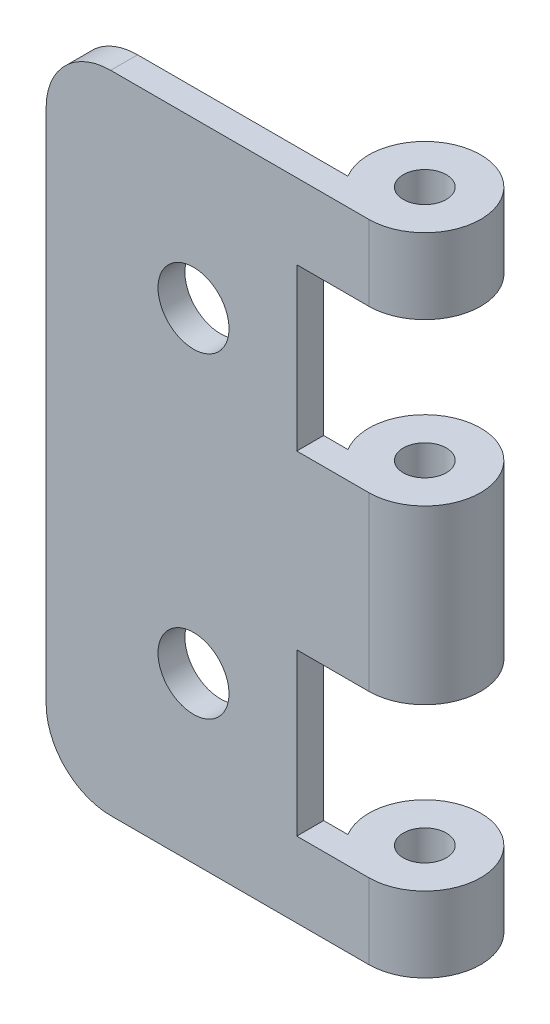
ISO-10303-21;
HEADER;
FILE_DESCRIPTION(('STEP AP214'),'2;1');
FILE_NAME('part.step','',(''),(''),'','','');
FILE_SCHEMA(('AUTOMOTIVE_DESIGN { 1 0 10303 214 1 1 1 1 }'));
ENDSEC;
DATA;
#1=APPLICATION_CONTEXT('core data for automotive mechanical design processes');
#2=APPLICATION_PROTOCOL_DEFINITION('international standard','automotive_design',2000,#1);
#3=PRODUCT_CONTEXT('',#1,'mechanical');
#4=PRODUCT('Part','Part','',(#3));
#5=PRODUCT_RELATED_PRODUCT_CATEGORY('part','',(#4));
#6=PRODUCT_DEFINITION_FORMATION('','',#4);
#7=PRODUCT_DEFINITION_CONTEXT('part definition',#1,'design');
#8=PRODUCT_DEFINITION('design','',#6,#7);
#9=PRODUCT_DEFINITION_SHAPE('','',#8);
#10=(LENGTH_UNIT() NAMED_UNIT(*) SI_UNIT(.MILLI.,.METRE.));
#11=(NAMED_UNIT(*) PLANE_ANGLE_UNIT() SI_UNIT($,.RADIAN.));
#12=(NAMED_UNIT(*) SI_UNIT($,.STERADIAN.) SOLID_ANGLE_UNIT());
#13=UNCERTAINTY_MEASURE_WITH_UNIT(LENGTH_MEASURE(1.E-05),#10,'distance_accuracy_value','');
#14=(GEOMETRIC_REPRESENTATION_CONTEXT(3) GLOBAL_UNCERTAINTY_ASSIGNED_CONTEXT((#13)) GLOBAL_UNIT_ASSIGNED_CONTEXT((#10,
#11,#12)) REPRESENTATION_CONTEXT('',''));
#15=CARTESIAN_POINT('',(0.,0.,0.));
#16=DIRECTION('',(0.,0.,1.));
#17=DIRECTION('',(1.,0.,0.));
#18=AXIS2_PLACEMENT_3D('',#15,#16,#17);
#19=CARTESIAN_POINT('',(7.62,68.58,-2.6658271083128));
#20=DIRECTION('',(0.,0.,1.));
#21=DIRECTION('',(1.,0.,0.));
#22=AXIS2_PLACEMENT_3D('',#19,#20,#21);
#23=CYLINDRICAL_SURFACE('',#22,7.62);
#24=DIRECTION('',(0.,0.,1.));
#25=VECTOR('',#24,1.);
#26=CARTESIAN_POINT('',(7.62,76.2,-2.6658271083128));
#27=LINE('',#26,#25);
#28=CARTESIAN_POINT('',(7.62,76.2,-3.175));
#29=VERTEX_POINT('',#28);
#30=CARTESIAN_POINT('',(7.62,76.2,0.));
#31=VERTEX_POINT('',#30);
#32=EDGE_CURVE('E189',#29,#31,#27,.T.);
#33=ORIENTED_EDGE('',*,*,#32,.F.);
#34=CARTESIAN_POINT('',(7.62,68.58,-3.175));
#35=DIRECTION('',(0.,0.,-1.));
#36=DIRECTION('',(-1.,0.,0.));
#37=AXIS2_PLACEMENT_3D('',#34,#35,#36);
#38=CIRCLE('',#37,7.62);
#39=CARTESIAN_POINT('',(0.,68.58,-3.175));
#40=VERTEX_POINT('',#39);
#41=EDGE_CURVE('E42',#40,#29,#38,.T.);
#42=ORIENTED_EDGE('',*,*,#41,.F.);
#43=DIRECTION('',(0.,0.,1.));
#44=VECTOR('',#43,1.);
#45=CARTESIAN_POINT('',(0.,68.58,-2.6658271083128));
#46=LINE('',#45,#44);
#47=CARTESIAN_POINT('',(0.,68.58,0.));
#48=VERTEX_POINT('',#47);
#49=EDGE_CURVE('E192',#48,#40,#46,.F.);
#50=ORIENTED_EDGE('',*,*,#49,.F.);
#51=CARTESIAN_POINT('',(7.62,68.58,0.));
#52=DIRECTION('',(0.,0.,-1.));
#53=DIRECTION('',(-1.,0.,0.));
#54=AXIS2_PLACEMENT_3D('',#51,#52,#53);
#55=CIRCLE('',#54,7.62);
#56=EDGE_CURVE('E11',#31,#48,#55,.F.);
#57=ORIENTED_EDGE('',*,*,#56,.F.);
#58=EDGE_LOOP('',(#33,#42,#50,#57));
#59=FACE_BOUND('',#58,.T.);
#60=ADVANCED_FACE('F35',(#59),#23,.T.);
#61=CARTESIAN_POINT('',(7.62,7.62,-2.6658271083128));
#62=DIRECTION('',(0.,0.,-1.));
#63=DIRECTION('',(-1.,0.,0.));
#64=AXIS2_PLACEMENT_3D('',#61,#62,#63);
#65=CYLINDRICAL_SURFACE('',#64,7.62);
#66=DIRECTION('',(0.,0.,1.));
#67=VECTOR('',#66,1.);
#68=CARTESIAN_POINT('',(0.,7.62,-2.6658271083128));
#69=LINE('',#68,#67);
#70=CARTESIAN_POINT('',(0.,7.62000000000002,-3.175));
#71=VERTEX_POINT('',#70);
#72=CARTESIAN_POINT('',(0.,7.62000000000002,0.));
#73=VERTEX_POINT('',#72);
#74=EDGE_CURVE('E172',#71,#73,#69,.T.);
#75=ORIENTED_EDGE('',*,*,#74,.F.);
#76=CARTESIAN_POINT('',(7.62,7.62,-3.175));
#77=DIRECTION('',(0.,0.,-1.));
#78=DIRECTION('',(-1.,0.,0.));
#79=AXIS2_PLACEMENT_3D('',#76,#77,#78);
#80=CIRCLE('',#79,7.62);
#81=CARTESIAN_POINT('',(7.62,0.,-3.175));
#82=VERTEX_POINT('',#81);
#83=EDGE_CURVE('E184',#82,#71,#80,.T.);
#84=ORIENTED_EDGE('',*,*,#83,.F.);
#85=DIRECTION('',(0.,0.,1.));
#86=VECTOR('',#85,1.);
#87=CARTESIAN_POINT('',(7.62,0.,-2.6658271083128));
#88=LINE('',#87,#86);
#89=CARTESIAN_POINT('',(7.62,0.,0.));
#90=VERTEX_POINT('',#89);
#91=EDGE_CURVE('E181',#90,#82,#88,.F.);
#92=ORIENTED_EDGE('',*,*,#91,.F.);
#93=CARTESIAN_POINT('',(7.62,7.62,0.));
#94=DIRECTION('',(0.,0.,-1.));
#95=DIRECTION('',(-1.,0.,0.));
#96=AXIS2_PLACEMENT_3D('',#93,#94,#95);
#97=CIRCLE('',#96,7.62);
#98=EDGE_CURVE('E187',#73,#90,#97,.F.);
#99=ORIENTED_EDGE('',*,*,#98,.F.);
#100=EDGE_LOOP('',(#75,#84,#92,#99));
#101=FACE_BOUND('',#100,.T.);
#102=ADVANCED_FACE('F300',(#101),#65,.T.);
#103=CARTESIAN_POINT('',(-13.8136565855366,76.2,0.));
#104=DIRECTION('',(0.,0.,-1.));
#105=DIRECTION('',(-1.,0.,0.));
#106=AXIS2_PLACEMENT_3D('',#103,#104,#105);
#107=PLANE('',#106);
#108=CARTESIAN_POINT('',(17.399,56.769,0.));
#109=DIRECTION('',(0.,0.,-1.));
#110=DIRECTION('',(-1.,0.,0.));
#111=AXIS2_PLACEMENT_3D('',#108,#109,#110);
#112=CIRCLE('',#111,4.191);
#113=CARTESIAN_POINT('',(13.208,56.769,0.));
#114=VERTEX_POINT('',#113);
#115=EDGE_CURVE('E210',#114,#114,#112,.T.);
#116=ORIENTED_EDGE('',*,*,#115,.T.);
#117=EDGE_LOOP('',(#116));
#118=FACE_BOUND('',#117,.T.);
#119=CARTESIAN_POINT('',(17.399,19.431,0.));
#120=DIRECTION('',(0.,0.,-1.));
#121=DIRECTION('',(-1.,0.,0.));
#122=AXIS2_PLACEMENT_3D('',#119,#120,#121);
#123=CIRCLE('',#122,4.191);
#124=CARTESIAN_POINT('',(13.208,19.431,0.));
#125=VERTEX_POINT('',#124);
#126=EDGE_CURVE('E223',#125,#125,#123,.T.);
#127=ORIENTED_EDGE('',*,*,#126,.T.);
#128=EDGE_LOOP('',(#127));
#129=FACE_BOUND('',#128,.T.);
#130=DIRECTION('',(1.,0.,0.));
#131=VECTOR('',#130,1.);
#132=CARTESIAN_POINT('',(-13.8136565855366,76.2,0.));
#133=LINE('',#132,#131);
#134=CARTESIAN_POINT('',(38.1,76.2,0.));
#135=VERTEX_POINT('',#134);
#136=EDGE_CURVE('E203',#31,#135,#133,.T.);
#137=ORIENTED_EDGE('',*,*,#136,.F.);
#138=ORIENTED_EDGE('',*,*,#56,.T.);
#139=DIRECTION('',(0.,-1.,0.));
#140=VECTOR('',#139,1.);
#141=CARTESIAN_POINT('',(0.,76.2,0.));
#142=LINE('',#141,#140);
#143=EDGE_CURVE('E201',#48,#73,#142,.T.);
#144=ORIENTED_EDGE('',*,*,#143,.T.);
#145=ORIENTED_EDGE('',*,*,#98,.T.);
#146=DIRECTION('',(1.,0.,0.));
#147=VECTOR('',#146,1.);
#148=CARTESIAN_POINT('',(-13.8136565855366,0.,0.));
#149=LINE('',#148,#147);
#150=CARTESIAN_POINT('',(38.1,0.,0.));
#151=VERTEX_POINT('',#150);
#152=EDGE_CURVE('E207',#90,#151,#149,.T.);
#153=ORIENTED_EDGE('',*,*,#152,.T.);
#154=DIRECTION('',(0.,-1.,0.));
#155=VECTOR('',#154,1.);
#156=CARTESIAN_POINT('',(38.1,76.2,0.));
#157=LINE('',#156,#155);
#158=CARTESIAN_POINT('',(38.1,8.89,0.));
#159=VERTEX_POINT('',#158);
#160=EDGE_CURVE('E163',#159,#151,#157,.T.);
#161=ORIENTED_EDGE('',*,*,#160,.F.);
#162=DIRECTION('',(1.,0.,0.));
#163=VECTOR('',#162,1.);
#164=CARTESIAN_POINT('',(-13.8136565855366,8.89,0.));
#165=LINE('',#164,#163);
#166=CARTESIAN_POINT('',(29.591,8.89,0.));
#167=VERTEX_POINT('',#166);
#168=EDGE_CURVE('E244',#167,#159,#165,.T.);
#169=ORIENTED_EDGE('',*,*,#168,.F.);
#170=DIRECTION('',(0.,-1.,0.));
#171=VECTOR('',#170,1.);
#172=CARTESIAN_POINT('',(29.591,27.94,0.));
#173=LINE('',#172,#171);
#174=CARTESIAN_POINT('',(29.591,27.94,0.));
#175=VERTEX_POINT('',#174);
#176=EDGE_CURVE('E232',#175,#167,#173,.T.);
#177=ORIENTED_EDGE('',*,*,#176,.F.);
#178=DIRECTION('',(1.,0.,0.));
#179=VECTOR('',#178,1.);
#180=CARTESIAN_POINT('',(-13.8136565855366,27.94,0.));
#181=LINE('',#180,#179);
#182=CARTESIAN_POINT('',(38.1,27.94,0.));
#183=VERTEX_POINT('',#182);
#184=EDGE_CURVE('E238',#175,#183,#181,.T.);
#185=ORIENTED_EDGE('',*,*,#184,.T.);
#186=CARTESIAN_POINT('',(38.1,48.26,0.));
#187=VERTEX_POINT('',#186);
#188=EDGE_CURVE('E173',#187,#183,#157,.T.);
#189=ORIENTED_EDGE('',*,*,#188,.F.);
#190=DIRECTION('',(1.,0.,0.));
#191=VECTOR('',#190,1.);
#192=CARTESIAN_POINT('',(-13.8136565855366,48.26,0.));
#193=LINE('',#192,#191);
#194=CARTESIAN_POINT('',(29.591,48.26,0.));
#195=VERTEX_POINT('',#194);
#196=EDGE_CURVE('E139',#195,#187,#193,.T.);
#197=ORIENTED_EDGE('',*,*,#196,.F.);
#198=DIRECTION('',(0.,1.,0.));
#199=VECTOR('',#198,1.);
#200=CARTESIAN_POINT('',(29.591,48.26,0.));
#201=LINE('',#200,#199);
#202=CARTESIAN_POINT('',(29.591,67.31,0.));
#203=VERTEX_POINT('',#202);
#204=EDGE_CURVE('E246',#195,#203,#201,.T.);
#205=ORIENTED_EDGE('',*,*,#204,.T.);
#206=DIRECTION('',(1.,0.,0.));
#207=VECTOR('',#206,1.);
#208=CARTESIAN_POINT('',(-13.8136565855366,67.31,0.));
#209=LINE('',#208,#207);
#210=CARTESIAN_POINT('',(38.1,67.31,0.));
#211=VERTEX_POINT('',#210);
#212=EDGE_CURVE('E143',#203,#211,#209,.T.);
#213=ORIENTED_EDGE('',*,*,#212,.T.);
#214=EDGE_CURVE('E169',#135,#211,#157,.T.);
#215=ORIENTED_EDGE('',*,*,#214,.F.);
#216=EDGE_LOOP('',(#137,#138,#144,#145,#153,#161,#169,#177,#185,#189,#197,#205,#213,#215));
#217=FACE_BOUND('',#216,.T.);
#218=ADVANCED_FACE('F304',(#118,#129,#217),#107,.F.);
#219=CARTESIAN_POINT('',(38.1,76.2,-6.604));
#220=DIRECTION('',(0.,-1.,0.));
#221=DIRECTION('',(0.,0.,-1.));
#222=AXIS2_PLACEMENT_3D('',#219,#220,#221);
#223=CYLINDRICAL_SURFACE('',#222,6.604);
#224=CARTESIAN_POINT('',(38.1,48.26,-6.604));
#225=DIRECTION('',(0.,1.,0.));
#226=DIRECTION('',(0.,0.,1.));
#227=AXIS2_PLACEMENT_3D('',#224,#225,#226);
#228=CIRCLE('',#227,6.604);
#229=CARTESIAN_POINT('',(32.4559965450046,48.26,-3.175));
#230=VERTEX_POINT('',#229);
#231=EDGE_CURVE('E132',#187,#230,#228,.T.);
#232=ORIENTED_EDGE('',*,*,#231,.F.);
#233=ORIENTED_EDGE('',*,*,#188,.T.);
#234=CARTESIAN_POINT('',(38.1,27.94,-6.604));
#235=DIRECTION('',(0.,1.,0.));
#236=DIRECTION('',(0.,0.,1.));
#237=AXIS2_PLACEMENT_3D('',#234,#235,#236);
#238=CIRCLE('',#237,6.604);
#239=CARTESIAN_POINT('',(32.4559965450046,27.94,-3.175));
#240=VERTEX_POINT('',#239);
#241=EDGE_CURVE('E158',#183,#240,#238,.T.);
#242=ORIENTED_EDGE('',*,*,#241,.T.);
#243=DIRECTION('',(0.,-1.,0.));
#244=VECTOR('',#243,1.);
#245=CARTESIAN_POINT('',(32.4559965450046,76.2,-3.175));
#246=LINE('',#245,#244);
#247=EDGE_CURVE('E149',#230,#240,#246,.T.);
#248=ORIENTED_EDGE('',*,*,#247,.F.);
#249=EDGE_LOOP('',(#232,#233,#242,#248));
#250=FACE_BOUND('',#249,.T.);
#251=ADVANCED_FACE('F156',(#250),#223,.T.);
#252=CARTESIAN_POINT('',(-13.8136565855366,76.2,-3.175));
#253=DIRECTION('',(0.,0.,-1.));
#254=DIRECTION('',(-1.,0.,0.));
#255=AXIS2_PLACEMENT_3D('',#252,#253,#254);
#256=PLANE('',#255);
#257=CARTESIAN_POINT('',(17.399,56.769,-3.175));
#258=DIRECTION('',(0.,0.,-1.));
#259=DIRECTION('',(-1.,0.,0.));
#260=AXIS2_PLACEMENT_3D('',#257,#258,#259);
#261=CIRCLE('',#260,4.191);
#262=CARTESIAN_POINT('',(13.208,56.769,-3.175));
#263=VERTEX_POINT('',#262);
#264=EDGE_CURVE('E220',#263,#263,#261,.T.);
#265=ORIENTED_EDGE('',*,*,#264,.F.);
#266=EDGE_LOOP('',(#265));
#267=FACE_BOUND('',#266,.T.);
#268=CARTESIAN_POINT('',(17.399,19.431,-3.175));
#269=DIRECTION('',(0.,0.,-1.));
#270=DIRECTION('',(-1.,0.,0.));
#271=AXIS2_PLACEMENT_3D('',#268,#269,#270);
#272=CIRCLE('',#271,4.191);
#273=CARTESIAN_POINT('',(13.208,19.431,-3.175));
#274=VERTEX_POINT('',#273);
#275=EDGE_CURVE('E226',#274,#274,#272,.T.);
#276=ORIENTED_EDGE('',*,*,#275,.F.);
#277=EDGE_LOOP('',(#276));
#278=FACE_BOUND('',#277,.T.);
#279=DIRECTION('',(0.,-1.,0.));
#280=VECTOR('',#279,1.);
#281=CARTESIAN_POINT('',(0.,76.2,-3.175));
#282=LINE('',#281,#280);
#283=EDGE_CURVE('E165',#40,#71,#282,.T.);
#284=ORIENTED_EDGE('',*,*,#283,.F.);
#285=ORIENTED_EDGE('',*,*,#41,.T.);
#286=DIRECTION('',(1.,0.,0.));
#287=VECTOR('',#286,1.);
#288=CARTESIAN_POINT('',(-13.8136565855366,76.2,-3.175));
#289=LINE('',#288,#287);
#290=CARTESIAN_POINT('',(32.4559965450046,76.2,-3.175));
#291=VERTEX_POINT('',#290);
#292=EDGE_CURVE('E194',#29,#291,#289,.T.);
#293=ORIENTED_EDGE('',*,*,#292,.T.);
#294=CARTESIAN_POINT('',(32.4559965450046,67.31,-3.175));
#295=VERTEX_POINT('',#294);
#296=EDGE_CURVE('E159',#291,#295,#246,.T.);
#297=ORIENTED_EDGE('',*,*,#296,.T.);
#298=DIRECTION('',(1.,0.,0.));
#299=VECTOR('',#298,1.);
#300=CARTESIAN_POINT('',(-13.8136565855366,67.31,-3.175));
#301=LINE('',#300,#299);
#302=CARTESIAN_POINT('',(29.591,67.31,-3.175));
#303=VERTEX_POINT('',#302);
#304=EDGE_CURVE('E262',#303,#295,#301,.T.);
#305=ORIENTED_EDGE('',*,*,#304,.F.);
#306=DIRECTION('',(0.,1.,0.));
#307=VECTOR('',#306,1.);
#308=CARTESIAN_POINT('',(29.591,48.26,-3.175));
#309=LINE('',#308,#307);
#310=CARTESIAN_POINT('',(29.591,48.26,-3.175));
#311=VERTEX_POINT('',#310);
#312=EDGE_CURVE('E152',#311,#303,#309,.T.);
#313=ORIENTED_EDGE('',*,*,#312,.F.);
#314=DIRECTION('',(1.,0.,0.));
#315=VECTOR('',#314,1.);
#316=CARTESIAN_POINT('',(-13.8136565855366,48.26,-3.175));
#317=LINE('',#316,#315);
#318=EDGE_CURVE('E136',#311,#230,#317,.T.);
#319=ORIENTED_EDGE('',*,*,#318,.T.);
#320=ORIENTED_EDGE('',*,*,#247,.T.);
#321=DIRECTION('',(1.,0.,0.));
#322=VECTOR('',#321,1.);
#323=CARTESIAN_POINT('',(-13.8136565855366,27.94,-3.175));
#324=LINE('',#323,#322);
#325=CARTESIAN_POINT('',(29.591,27.94,-3.175));
#326=VERTEX_POINT('',#325);
#327=EDGE_CURVE('E249',#326,#240,#324,.T.);
#328=ORIENTED_EDGE('',*,*,#327,.F.);
#329=DIRECTION('',(0.,-1.,0.));
#330=VECTOR('',#329,1.);
#331=CARTESIAN_POINT('',(29.591,27.94,-3.175));
#332=LINE('',#331,#330);
#333=CARTESIAN_POINT('',(29.591,8.89,-3.175));
#334=VERTEX_POINT('',#333);
#335=EDGE_CURVE('E229',#326,#334,#332,.T.);
#336=ORIENTED_EDGE('',*,*,#335,.T.);
#337=DIRECTION('',(1.,0.,0.));
#338=VECTOR('',#337,1.);
#339=CARTESIAN_POINT('',(-13.8136565855366,8.89,-3.175));
#340=LINE('',#339,#338);
#341=CARTESIAN_POINT('',(32.4559965450046,8.89000000000002,-3.175));
#342=VERTEX_POINT('',#341);
#343=EDGE_CURVE('E239',#334,#342,#340,.T.);
#344=ORIENTED_EDGE('',*,*,#343,.T.);
#345=CARTESIAN_POINT('',(32.4559965450046,0.,-3.175));
#346=VERTEX_POINT('',#345);
#347=EDGE_CURVE('E160',#342,#346,#246,.T.);
#348=ORIENTED_EDGE('',*,*,#347,.T.);
#349=DIRECTION('',(1.,0.,0.));
#350=VECTOR('',#349,1.);
#351=CARTESIAN_POINT('',(-13.8136565855366,0.,-3.175));
#352=LINE('',#351,#350);
#353=EDGE_CURVE('E213',#82,#346,#352,.T.);
#354=ORIENTED_EDGE('',*,*,#353,.F.);
#355=ORIENTED_EDGE('',*,*,#83,.T.);
#356=EDGE_LOOP('',(#284,#285,#293,#297,#305,#313,#319,#320,#328,#336,#344,#348,#354,#355));
#357=FACE_BOUND('',#356,.T.);
#358=ADVANCED_FACE('F147',(#267,#278,#357),#256,.T.);
#359=CARTESIAN_POINT('',(38.1,8.89,-6.604));
#360=DIRECTION('',(0.,1.,0.));
#361=DIRECTION('',(0.,0.,1.));
#362=AXIS2_PLACEMENT_3D('',#359,#360,#361);
#363=CIRCLE('',#362,6.604);
#364=EDGE_CURVE('E242',#159,#342,#363,.T.);
#365=ORIENTED_EDGE('',*,*,#364,.F.);
#366=ORIENTED_EDGE('',*,*,#160,.T.);
#367=CARTESIAN_POINT('',(38.1,0.,-6.604));
#368=DIRECTION('',(0.,1.,0.));
#369=DIRECTION('',(0.,0.,1.));
#370=AXIS2_PLACEMENT_3D('',#367,#368,#369);
#371=CIRCLE('',#370,6.604);
#372=EDGE_CURVE('E209',#151,#346,#371,.T.);
#373=ORIENTED_EDGE('',*,*,#372,.T.);
#374=ORIENTED_EDGE('',*,*,#347,.F.);
#375=EDGE_LOOP('',(#365,#366,#373,#374));
#376=FACE_BOUND('',#375,.T.);
#377=ADVANCED_FACE('F317',(#376),#223,.T.);
#378=ORIENTED_EDGE('',*,*,#214,.T.);
#379=CARTESIAN_POINT('',(38.1,67.31,-6.604));
#380=DIRECTION('',(0.,1.,0.));
#381=DIRECTION('',(0.,0.,1.));
#382=AXIS2_PLACEMENT_3D('',#379,#380,#381);
#383=CIRCLE('',#382,6.604);
#384=EDGE_CURVE('E264',#211,#295,#383,.T.);
#385=ORIENTED_EDGE('',*,*,#384,.T.);
#386=ORIENTED_EDGE('',*,*,#296,.F.);
#387=CARTESIAN_POINT('',(38.1,76.2,-6.604));
#388=DIRECTION('',(0.,1.,0.));
#389=DIRECTION('',(0.,0.,1.));
#390=AXIS2_PLACEMENT_3D('',#387,#388,#389);
#391=CIRCLE('',#390,6.604);
#392=EDGE_CURVE('E199',#135,#291,#391,.T.);
#393=ORIENTED_EDGE('',*,*,#392,.F.);
#394=EDGE_LOOP('',(#378,#385,#386,#393));
#395=FACE_BOUND('',#394,.T.);
#396=ADVANCED_FACE('F313',(#395),#223,.T.);
#397=CARTESIAN_POINT('',(0.,76.2,-2.6658271083128));
#398=DIRECTION('',(-1.,0.,0.));
#399=DIRECTION('',(0.,0.,1.));
#400=AXIS2_PLACEMENT_3D('',#397,#398,#399);
#401=PLANE('',#400);
#402=ORIENTED_EDGE('',*,*,#143,.F.);
#403=ORIENTED_EDGE('',*,*,#49,.T.);
#404=ORIENTED_EDGE('',*,*,#283,.T.);
#405=ORIENTED_EDGE('',*,*,#74,.T.);
#406=EDGE_LOOP('',(#402,#403,#404,#405));
#407=FACE_BOUND('',#406,.T.);
#408=ADVANCED_FACE('F316',(#407),#401,.T.);
#409=CARTESIAN_POINT('',(-13.8136565855366,76.2,-2.6658271083128));
#410=DIRECTION('',(0.,1.,0.));
#411=DIRECTION('',(0.,0.,1.));
#412=AXIS2_PLACEMENT_3D('',#409,#410,#411);
#413=PLANE('',#412);
#414=CARTESIAN_POINT('',(38.1,76.2,-6.604));
#415=DIRECTION('',(0.,1.,0.));
#416=DIRECTION('',(0.,0.,1.));
#417=AXIS2_PLACEMENT_3D('',#414,#415,#416);
#418=CIRCLE('',#417,2.54);
#419=CARTESIAN_POINT('',(38.1,76.2,-4.064));
#420=VERTEX_POINT('',#419);
#421=EDGE_CURVE('E277',#420,#420,#418,.T.);
#422=ORIENTED_EDGE('',*,*,#421,.F.);
#423=EDGE_LOOP('',(#422));
#424=FACE_BOUND('',#423,.T.);
#425=ORIENTED_EDGE('',*,*,#292,.F.);
#426=ORIENTED_EDGE('',*,*,#32,.T.);
#427=ORIENTED_EDGE('',*,*,#136,.T.);
#428=ORIENTED_EDGE('',*,*,#392,.T.);
#429=EDGE_LOOP('',(#425,#426,#427,#428));
#430=FACE_BOUND('',#429,.T.);
#431=ADVANCED_FACE('F197',(#424,#430),#413,.T.);
#432=CARTESIAN_POINT('',(-13.8136565855366,0.,-2.6658271083128));
#433=DIRECTION('',(0.,1.,0.));
#434=DIRECTION('',(0.,0.,1.));
#435=AXIS2_PLACEMENT_3D('',#432,#433,#434);
#436=PLANE('',#435);
#437=CARTESIAN_POINT('',(38.1,0.,-6.604));
#438=DIRECTION('',(0.,1.,0.));
#439=DIRECTION('',(0.,0.,1.));
#440=AXIS2_PLACEMENT_3D('',#437,#438,#439);
#441=CIRCLE('',#440,2.54);
#442=CARTESIAN_POINT('',(38.1,0.,-4.064));
#443=VERTEX_POINT('',#442);
#444=EDGE_CURVE('E178',#443,#443,#441,.T.);
#445=ORIENTED_EDGE('',*,*,#444,.T.);
#446=EDGE_LOOP('',(#445));
#447=FACE_BOUND('',#446,.T.);
#448=ORIENTED_EDGE('',*,*,#152,.F.);
#449=ORIENTED_EDGE('',*,*,#91,.T.);
#450=ORIENTED_EDGE('',*,*,#353,.T.);
#451=ORIENTED_EDGE('',*,*,#372,.F.);
#452=EDGE_LOOP('',(#448,#449,#450,#451));
#453=FACE_BOUND('',#452,.T.);
#454=ADVANCED_FACE('F283',(#447,#453),#436,.F.);
#455=CARTESIAN_POINT('',(17.399,56.769,47.625));
#456=DIRECTION('',(0.,0.,-1.));
#457=DIRECTION('',(-1.,0.,0.));
#458=AXIS2_PLACEMENT_3D('',#455,#456,#457);
#459=CYLINDRICAL_SURFACE('',#458,4.191);
#460=ORIENTED_EDGE('',*,*,#264,.T.);
#461=EDGE_LOOP('',(#460));
#462=FACE_BOUND('',#461,.T.);
#463=ORIENTED_EDGE('',*,*,#115,.F.);
#464=EDGE_LOOP('',(#463));
#465=FACE_BOUND('',#464,.T.);
#466=ADVANCED_FACE('F327',(#462,#465),#459,.F.);
#467=CARTESIAN_POINT('',(17.399,19.431,47.625));
#468=DIRECTION('',(0.,0.,-1.));
#469=DIRECTION('',(-1.,0.,0.));
#470=AXIS2_PLACEMENT_3D('',#467,#468,#469);
#471=CYLINDRICAL_SURFACE('',#470,4.191);
#472=ORIENTED_EDGE('',*,*,#275,.T.);
#473=EDGE_LOOP('',(#472));
#474=FACE_BOUND('',#473,.T.);
#475=ORIENTED_EDGE('',*,*,#126,.F.);
#476=EDGE_LOOP('',(#475));
#477=FACE_BOUND('',#476,.T.);
#478=ADVANCED_FACE('F333',(#474,#477),#471,.F.);
#479=CARTESIAN_POINT('',(29.591,27.94,-2.6658271083128));
#480=DIRECTION('',(-1.,0.,0.));
#481=DIRECTION('',(0.,0.,1.));
#482=AXIS2_PLACEMENT_3D('',#479,#480,#481);
#483=PLANE('',#482);
#484=DIRECTION('',(0.,0.,-1.));
#485=VECTOR('',#484,1.);
#486=CARTESIAN_POINT('',(29.591,8.89,-2.6658271083128));
#487=LINE('',#486,#485);
#488=EDGE_CURVE('E235',#167,#334,#487,.T.);
#489=ORIENTED_EDGE('',*,*,#488,.T.);
#490=ORIENTED_EDGE('',*,*,#335,.F.);
#491=DIRECTION('',(0.,0.,-1.));
#492=VECTOR('',#491,1.);
#493=CARTESIAN_POINT('',(29.591,27.94,-2.6658271083128));
#494=LINE('',#493,#492);
#495=EDGE_CURVE('E234',#175,#326,#494,.T.);
#496=ORIENTED_EDGE('',*,*,#495,.F.);
#497=ORIENTED_EDGE('',*,*,#176,.T.);
#498=EDGE_LOOP('',(#489,#490,#496,#497));
#499=FACE_BOUND('',#498,.T.);
#500=ADVANCED_FACE('F337',(#499),#483,.F.);
#501=CARTESIAN_POINT('',(-13.8136565855366,27.94,-2.6658271083128));
#502=DIRECTION('',(0.,1.,0.));
#503=DIRECTION('',(0.,0.,1.));
#504=AXIS2_PLACEMENT_3D('',#501,#502,#503);
#505=PLANE('',#504);
#506=CARTESIAN_POINT('',(38.1,27.94,-6.604));
#507=DIRECTION('',(0.,1.,0.));
#508=DIRECTION('',(0.,0.,1.));
#509=AXIS2_PLACEMENT_3D('',#506,#507,#508);
#510=CIRCLE('',#509,2.54);
#511=CARTESIAN_POINT('',(38.1,27.94,-4.064));
#512=VERTEX_POINT('',#511);
#513=EDGE_CURVE('E267',#512,#512,#510,.T.);
#514=ORIENTED_EDGE('',*,*,#513,.T.);
#515=EDGE_LOOP('',(#514));
#516=FACE_BOUND('',#515,.T.);
#517=ORIENTED_EDGE('',*,*,#184,.F.);
#518=ORIENTED_EDGE('',*,*,#495,.T.);
#519=ORIENTED_EDGE('',*,*,#327,.T.);
#520=ORIENTED_EDGE('',*,*,#241,.F.);
#521=EDGE_LOOP('',(#517,#518,#519,#520));
#522=FACE_BOUND('',#521,.T.);
#523=ADVANCED_FACE('F341',(#516,#522),#505,.F.);
#524=CARTESIAN_POINT('',(-13.8136565855366,8.89,-2.6658271083128));
#525=DIRECTION('',(0.,1.,0.));
#526=DIRECTION('',(0.,0.,1.));
#527=AXIS2_PLACEMENT_3D('',#524,#525,#526);
#528=PLANE('',#527);
#529=CARTESIAN_POINT('',(38.1,8.89,-6.604));
#530=DIRECTION('',(0.,1.,0.));
#531=DIRECTION('',(0.,0.,1.));
#532=AXIS2_PLACEMENT_3D('',#529,#530,#531);
#533=CIRCLE('',#532,2.54);
#534=CARTESIAN_POINT('',(38.1,8.89,-4.064));
#535=VERTEX_POINT('',#534);
#536=EDGE_CURVE('E272',#535,#535,#533,.T.);
#537=ORIENTED_EDGE('',*,*,#536,.F.);
#538=EDGE_LOOP('',(#537));
#539=FACE_BOUND('',#538,.T.);
#540=ORIENTED_EDGE('',*,*,#168,.T.);
#541=ORIENTED_EDGE('',*,*,#364,.T.);
#542=ORIENTED_EDGE('',*,*,#343,.F.);
#543=ORIENTED_EDGE('',*,*,#488,.F.);
#544=EDGE_LOOP('',(#540,#541,#542,#543));
#545=FACE_BOUND('',#544,.T.);
#546=ADVANCED_FACE('F343',(#539,#545),#528,.T.);
#547=CARTESIAN_POINT('',(29.591,48.26,-2.6658271083128));
#548=DIRECTION('',(1.,0.,0.));
#549=DIRECTION('',(0.,0.,-1.));
#550=AXIS2_PLACEMENT_3D('',#547,#548,#549);
#551=PLANE('',#550);
#552=DIRECTION('',(0.,0.,-1.));
#553=VECTOR('',#552,1.);
#554=CARTESIAN_POINT('',(29.591,67.31,-2.6658271083128));
#555=LINE('',#554,#553);
#556=EDGE_CURVE('E259',#203,#303,#555,.T.);
#557=ORIENTED_EDGE('',*,*,#556,.F.);
#558=ORIENTED_EDGE('',*,*,#204,.F.);
#559=DIRECTION('',(0.,0.,-1.));
#560=VECTOR('',#559,1.);
#561=CARTESIAN_POINT('',(29.591,48.26,-2.6658271083128));
#562=LINE('',#561,#560);
#563=EDGE_CURVE('E153',#195,#311,#562,.T.);
#564=ORIENTED_EDGE('',*,*,#563,.T.);
#565=ORIENTED_EDGE('',*,*,#312,.T.);
#566=EDGE_LOOP('',(#557,#558,#564,#565));
#567=FACE_BOUND('',#566,.T.);
#568=ADVANCED_FACE('F346',(#567),#551,.T.);
#569=CARTESIAN_POINT('',(-13.8136565855366,48.26,-2.6658271083128));
#570=DIRECTION('',(0.,1.,0.));
#571=DIRECTION('',(0.,0.,1.));
#572=AXIS2_PLACEMENT_3D('',#569,#570,#571);
#573=PLANE('',#572);
#574=CARTESIAN_POINT('',(38.1,48.26,-6.604));
#575=DIRECTION('',(0.,1.,0.));
#576=DIRECTION('',(0.,0.,1.));
#577=AXIS2_PLACEMENT_3D('',#574,#575,#576);
#578=CIRCLE('',#577,2.54);
#579=CARTESIAN_POINT('',(38.1,48.26,-4.064));
#580=VERTEX_POINT('',#579);
#581=EDGE_CURVE('E177',#580,#580,#578,.T.);
#582=ORIENTED_EDGE('',*,*,#581,.F.);
#583=EDGE_LOOP('',(#582));
#584=FACE_BOUND('',#583,.T.);
#585=ORIENTED_EDGE('',*,*,#231,.T.);
#586=ORIENTED_EDGE('',*,*,#318,.F.);
#587=ORIENTED_EDGE('',*,*,#563,.F.);
#588=ORIENTED_EDGE('',*,*,#196,.T.);
#589=EDGE_LOOP('',(#585,#586,#587,#588));
#590=FACE_BOUND('',#589,.T.);
#591=ADVANCED_FACE('F134',(#584,#590),#573,.T.);
#592=CARTESIAN_POINT('',(-13.8136565855366,67.31,-2.6658271083128));
#593=DIRECTION('',(0.,1.,0.));
#594=DIRECTION('',(0.,0.,1.));
#595=AXIS2_PLACEMENT_3D('',#592,#593,#594);
#596=PLANE('',#595);
#597=CARTESIAN_POINT('',(38.1,67.31,-6.604));
#598=DIRECTION('',(0.,1.,0.));
#599=DIRECTION('',(0.,0.,1.));
#600=AXIS2_PLACEMENT_3D('',#597,#598,#599);
#601=CIRCLE('',#600,2.54);
#602=CARTESIAN_POINT('',(38.1,67.31,-4.064));
#603=VERTEX_POINT('',#602);
#604=EDGE_CURVE('E174',#603,#603,#601,.T.);
#605=ORIENTED_EDGE('',*,*,#604,.T.);
#606=EDGE_LOOP('',(#605));
#607=FACE_BOUND('',#606,.T.);
#608=ORIENTED_EDGE('',*,*,#384,.F.);
#609=ORIENTED_EDGE('',*,*,#212,.F.);
#610=ORIENTED_EDGE('',*,*,#556,.T.);
#611=ORIENTED_EDGE('',*,*,#304,.T.);
#612=EDGE_LOOP('',(#608,#609,#610,#611));
#613=FACE_BOUND('',#612,.T.);
#614=ADVANCED_FACE('F297',(#607,#613),#596,.F.);
#615=CARTESIAN_POINT('',(38.1,0.,-6.604));
#616=DIRECTION('',(0.,1.,0.));
#617=DIRECTION('',(0.,0.,1.));
#618=AXIS2_PLACEMENT_3D('',#615,#616,#617);
#619=CYLINDRICAL_SURFACE('',#618,2.54);
#620=CARTESIAN_POINT('',(38.1,76.2,-4.064));
#621=CARTESIAN_POINT('',(38.1,76.1073958333333,-4.064));
#622=CARTESIAN_POINT('',(38.1,76.0147916666667,-4.064));
#623=CARTESIAN_POINT('',(38.1,75.8295833333333,-4.064));
#624=CARTESIAN_POINT('',(38.1,75.7369791666667,-4.064));
#625=CARTESIAN_POINT('',(38.1,75.5517708333333,-4.064));
#626=CARTESIAN_POINT('',(38.1,75.4591666666667,-4.064));
#627=CARTESIAN_POINT('',(38.1,75.2739583333333,-4.064));
#628=CARTESIAN_POINT('',(38.1,75.1813541666667,-4.064));
#629=CARTESIAN_POINT('',(38.1,74.9961458333333,-4.064));
#630=CARTESIAN_POINT('',(38.1,74.9035416666667,-4.064));
#631=CARTESIAN_POINT('',(38.1,74.7183333333333,-4.064));
#632=CARTESIAN_POINT('',(38.1,74.6257291666667,-4.064));
#633=CARTESIAN_POINT('',(38.1,74.4405208333333,-4.064));
#634=CARTESIAN_POINT('',(38.1,74.3479166666667,-4.064));
#635=CARTESIAN_POINT('',(38.1,74.1627083333333,-4.064));
#636=CARTESIAN_POINT('',(38.1,74.0701041666667,-4.064));
#637=CARTESIAN_POINT('',(38.1,73.8848958333333,-4.064));
#638=CARTESIAN_POINT('',(38.1,73.7922916666667,-4.064));
#639=CARTESIAN_POINT('',(38.1,73.6070833333333,-4.064));
#640=CARTESIAN_POINT('',(38.1,73.5144791666667,-4.064));
#641=CARTESIAN_POINT('',(38.1,73.3292708333333,-4.064));
#642=CARTESIAN_POINT('',(38.1,73.2366666666667,-4.064));
#643=CARTESIAN_POINT('',(38.1,73.0514583333333,-4.064));
#644=CARTESIAN_POINT('',(38.1,72.9588541666667,-4.064));
#645=CARTESIAN_POINT('',(38.1,72.7736458333333,-4.064));
#646=CARTESIAN_POINT('',(38.1,72.6810416666667,-4.064));
#647=CARTESIAN_POINT('',(38.1,72.4958333333333,-4.064));
#648=CARTESIAN_POINT('',(38.1,72.4032291666667,-4.064));
#649=CARTESIAN_POINT('',(38.1,72.2180208333333,-4.064));
#650=CARTESIAN_POINT('',(38.1,72.1254166666667,-4.064));
#651=CARTESIAN_POINT('',(38.1,71.9402083333333,-4.064));
#652=CARTESIAN_POINT('',(38.1,71.8476041666667,-4.064));
#653=CARTESIAN_POINT('',(38.1,71.6623958333333,-4.064));
#654=CARTESIAN_POINT('',(38.1,71.5697916666667,-4.064));
#655=CARTESIAN_POINT('',(38.1,71.3845833333333,-4.064));
#656=CARTESIAN_POINT('',(38.1,71.2919791666667,-4.064));
#657=CARTESIAN_POINT('',(38.1,71.1067708333333,-4.064));
#658=CARTESIAN_POINT('',(38.1,71.0141666666667,-4.064));
#659=CARTESIAN_POINT('',(38.1,70.8289583333333,-4.064));
#660=CARTESIAN_POINT('',(38.1,70.7363541666667,-4.064));
#661=CARTESIAN_POINT('',(38.1,70.5511458333333,-4.064));
#662=CARTESIAN_POINT('',(38.1,70.4585416666667,-4.064));
#663=CARTESIAN_POINT('',(38.1,70.2733333333333,-4.064));
#664=CARTESIAN_POINT('',(38.1,70.1807291666667,-4.064));
#665=CARTESIAN_POINT('',(38.1,69.9955208333333,-4.064));
#666=CARTESIAN_POINT('',(38.1,69.9029166666667,-4.064));
#667=CARTESIAN_POINT('',(38.1,69.7177083333333,-4.064));
#668=CARTESIAN_POINT('',(38.1,69.6251041666667,-4.064));
#669=CARTESIAN_POINT('',(38.1,69.4398958333333,-4.064));
#670=CARTESIAN_POINT('',(38.1,69.3472916666667,-4.064));
#671=CARTESIAN_POINT('',(38.1,69.1620833333333,-4.064));
#672=CARTESIAN_POINT('',(38.1,69.0694791666667,-4.064));
#673=CARTESIAN_POINT('',(38.1,68.8842708333333,-4.064));
#674=CARTESIAN_POINT('',(38.1,68.7916666666667,-4.064));
#675=CARTESIAN_POINT('',(38.1,68.6064583333333,-4.064));
#676=CARTESIAN_POINT('',(38.1,68.5138541666667,-4.064));
#677=CARTESIAN_POINT('',(38.1,68.3286458333333,-4.064));
#678=CARTESIAN_POINT('',(38.1,68.2360416666667,-4.064));
#679=CARTESIAN_POINT('',(38.1,68.0508333333333,-4.064));
#680=CARTESIAN_POINT('',(38.1,67.9582291666667,-4.064));
#681=CARTESIAN_POINT('',(38.1,67.7730208333333,-4.064));
#682=CARTESIAN_POINT('',(38.1,67.6804166666667,-4.064));
#683=CARTESIAN_POINT('',(38.1,67.4952083333333,-4.064));
#684=CARTESIAN_POINT('',(38.1,67.4026041666667,-4.064));
#685=CARTESIAN_POINT('',(38.1,67.31,-4.064));
#686=B_SPLINE_CURVE_WITH_KNOTS('',3,(#620,#621,#622,#623,#624,#625,#626,#627,#628,#629,#630,
#631,#632,#633,#634,#635,#636,#637,#638,#639,#640,#641,#642,#643,#644,#645,#646,#647,#648,#649,
#650,#651,#652,#653,#654,#655,#656,#657,#658,#659,#660,#661,#662,#663,#664,#665,#666,#667,#668,
#669,#670,#671,#672,#673,#674,#675,#676,#677,#678,#679,#680,#681,#682,#683,#684,#685),
.UNSPECIFIED.,.F.,.F.,(4,2,2,2,2,2,2,2,2,2,2,2,2,2,2,2,2,2,2,2,2,2,2,2,2,2,2,2,2,2,2,2,4),(0.,
0.277812500000002,0.555625000000004,0.833437500000006,1.11125000000001,1.3890625,1.666875,
1.9446875,2.2225,2.5003125,2.77812500000001,3.05593750000001,3.33375,3.6115625,3.889375,
4.1671875,4.445,4.72281250000001,5.00062500000001,5.27843750000001,5.55625000000001,5.8340625,
6.111875,6.3896875,6.66750000000001,6.94531250000001,7.22312500000001,7.50093750000001,7.77875,
8.0565625,8.334375,8.61218750000001,8.89000000000001),.UNSPECIFIED.);
#687=EDGE_CURVE('BSEAM290',#420,#603,#686,.T.);
#688=ORIENTED_EDGE('',*,*,#421,.T.);
#689=ORIENTED_EDGE('',*,*,#604,.F.);
#690=ORIENTED_EDGE('',*,*,#687,.T.);
#691=ORIENTED_EDGE('',*,*,#687,.F.);
#692=EDGE_LOOP('',(#688,#690,#689,#691));
#693=FACE_BOUND('',#692,.T.);
#694=ADVANCED_FACE('F290',(#693),#619,.F.);
#695=CARTESIAN_POINT('',(38.1,48.26,-4.064));
#696=CARTESIAN_POINT('',(38.1,48.0483333333333,-4.064));
#697=CARTESIAN_POINT('',(38.1,47.8366666666667,-4.064));
#698=CARTESIAN_POINT('',(38.1,47.4133333333333,-4.064));
#699=CARTESIAN_POINT('',(38.1,47.2016666666667,-4.064));
#700=CARTESIAN_POINT('',(38.1,46.7783333333333,-4.064));
#701=CARTESIAN_POINT('',(38.1,46.5666666666667,-4.064));
#702=CARTESIAN_POINT('',(38.1,46.1433333333333,-4.064));
#703=CARTESIAN_POINT('',(38.1,45.9316666666667,-4.064));
#704=CARTESIAN_POINT('',(38.1,45.5083333333333,-4.064));
#705=CARTESIAN_POINT('',(38.1,45.2966666666667,-4.064));
#706=CARTESIAN_POINT('',(38.1,44.8733333333333,-4.064));
#707=CARTESIAN_POINT('',(38.1,44.6616666666667,-4.064));
#708=CARTESIAN_POINT('',(38.1,44.2383333333333,-4.064));
#709=CARTESIAN_POINT('',(38.1,44.0266666666667,-4.064));
#710=CARTESIAN_POINT('',(38.1,43.6033333333333,-4.064));
#711=CARTESIAN_POINT('',(38.1,43.3916666666667,-4.064));
#712=CARTESIAN_POINT('',(38.1,42.9683333333333,-4.064));
#713=CARTESIAN_POINT('',(38.1,42.7566666666667,-4.064));
#714=CARTESIAN_POINT('',(38.1,42.3333333333333,-4.064));
#715=CARTESIAN_POINT('',(38.1,42.1216666666667,-4.064));
#716=CARTESIAN_POINT('',(38.1,41.6983333333333,-4.064));
#717=CARTESIAN_POINT('',(38.1,41.4866666666667,-4.064));
#718=CARTESIAN_POINT('',(38.1,41.0633333333333,-4.064));
#719=CARTESIAN_POINT('',(38.1,40.8516666666667,-4.064));
#720=CARTESIAN_POINT('',(38.1,40.4283333333333,-4.064));
#721=CARTESIAN_POINT('',(38.1,40.2166666666667,-4.064));
#722=CARTESIAN_POINT('',(38.1,39.7933333333333,-4.064));
#723=CARTESIAN_POINT('',(38.1,39.5816666666667,-4.064));
#724=CARTESIAN_POINT('',(38.1,39.1583333333333,-4.064));
#725=CARTESIAN_POINT('',(38.1,38.9466666666667,-4.064));
#726=CARTESIAN_POINT('',(38.1,38.5233333333333,-4.064));
#727=CARTESIAN_POINT('',(38.1,38.3116666666667,-4.064));
#728=CARTESIAN_POINT('',(38.1,37.8883333333333,-4.064));
#729=CARTESIAN_POINT('',(38.1,37.6766666666667,-4.064));
#730=CARTESIAN_POINT('',(38.1,37.2533333333333,-4.064));
#731=CARTESIAN_POINT('',(38.1,37.0416666666667,-4.064));
#732=CARTESIAN_POINT('',(38.1,36.6183333333333,-4.064));
#733=CARTESIAN_POINT('',(38.1,36.4066666666667,-4.064));
#734=CARTESIAN_POINT('',(38.1,35.9833333333333,-4.064));
#735=CARTESIAN_POINT('',(38.1,35.7716666666667,-4.064));
#736=CARTESIAN_POINT('',(38.1,35.3483333333333,-4.064));
#737=CARTESIAN_POINT('',(38.1,35.1366666666667,-4.064));
#738=CARTESIAN_POINT('',(38.1,34.7133333333333,-4.064));
#739=CARTESIAN_POINT('',(38.1,34.5016666666667,-4.064));
#740=CARTESIAN_POINT('',(38.1,34.0783333333333,-4.064));
#741=CARTESIAN_POINT('',(38.1,33.8666666666667,-4.064));
#742=CARTESIAN_POINT('',(38.1,33.4433333333333,-4.064));
#743=CARTESIAN_POINT('',(38.1,33.2316666666667,-4.064));
#744=CARTESIAN_POINT('',(38.1,32.8083333333333,-4.064));
#745=CARTESIAN_POINT('',(38.1,32.5966666666667,-4.064));
#746=CARTESIAN_POINT('',(38.1,32.1733333333333,-4.064));
#747=CARTESIAN_POINT('',(38.1,31.9616666666667,-4.064));
#748=CARTESIAN_POINT('',(38.1,31.5383333333333,-4.064));
#749=CARTESIAN_POINT('',(38.1,31.3266666666667,-4.064));
#750=CARTESIAN_POINT('',(38.1,30.9033333333333,-4.064));
#751=CARTESIAN_POINT('',(38.1,30.6916666666667,-4.064));
#752=CARTESIAN_POINT('',(38.1,30.2683333333333,-4.064));
#753=CARTESIAN_POINT('',(38.1,30.0566666666667,-4.064));
#754=CARTESIAN_POINT('',(38.1,29.6333333333333,-4.064));
#755=CARTESIAN_POINT('',(38.1,29.4216666666667,-4.064));
#756=CARTESIAN_POINT('',(38.1,28.9983333333333,-4.064));
#757=CARTESIAN_POINT('',(38.1,28.7866666666667,-4.064));
#758=CARTESIAN_POINT('',(38.1,28.3633333333333,-4.064));
#759=CARTESIAN_POINT('',(38.1,28.1516666666667,-4.064));
#760=CARTESIAN_POINT('',(38.1,27.94,-4.064));
#761=B_SPLINE_CURVE_WITH_KNOTS('',3,(#695,#696,#697,#698,#699,#700,#701,#702,#703,#704,#705,
#706,#707,#708,#709,#710,#711,#712,#713,#714,#715,#716,#717,#718,#719,#720,#721,#722,#723,#724,
#725,#726,#727,#728,#729,#730,#731,#732,#733,#734,#735,#736,#737,#738,#739,#740,#741,#742,#743,
#744,#745,#746,#747,#748,#749,#750,#751,#752,#753,#754,#755,#756,#757,#758,#759,#760),
.UNSPECIFIED.,.F.,.F.,(4,2,2,2,2,2,2,2,2,2,2,2,2,2,2,2,2,2,2,2,2,2,2,2,2,2,2,2,2,2,2,2,4),(0.,
0.634999999999997,1.27,1.905,2.54,3.175,3.81,4.445,5.08,5.715,6.35,6.985,7.62,8.255,8.89,9.525,
10.16,10.795,11.43,12.065,12.7,13.335,13.97,14.605,15.24,15.875,16.51,17.145,17.78,18.415,19.05,
19.685,20.32),.UNSPECIFIED.);
#762=EDGE_CURVE('BSEAM287',#580,#512,#761,.T.);
#763=ORIENTED_EDGE('',*,*,#581,.T.);
#764=ORIENTED_EDGE('',*,*,#513,.F.);
#765=ORIENTED_EDGE('',*,*,#762,.T.);
#766=ORIENTED_EDGE('',*,*,#762,.F.);
#767=EDGE_LOOP('',(#763,#765,#764,#766));
#768=FACE_BOUND('',#767,.T.);
#769=ADVANCED_FACE('F287',(#768),#619,.F.);
#770=CARTESIAN_POINT('',(38.1,8.89,-4.064));
#771=CARTESIAN_POINT('',(38.1,8.79739583333333,-4.064));
#772=CARTESIAN_POINT('',(38.1,8.70479166666666,-4.064));
#773=CARTESIAN_POINT('',(38.1,8.51958333333333,-4.064));
#774=CARTESIAN_POINT('',(38.1,8.42697916666666,-4.064));
#775=CARTESIAN_POINT('',(38.1,8.24177083333333,-4.064));
#776=CARTESIAN_POINT('',(38.1,8.14916666666666,-4.064));
#777=CARTESIAN_POINT('',(38.1,7.96395833333333,-4.064));
#778=CARTESIAN_POINT('',(38.1,7.87135416666667,-4.064));
#779=CARTESIAN_POINT('',(38.1,7.68614583333333,-4.064));
#780=CARTESIAN_POINT('',(38.1,7.59354166666667,-4.064));
#781=CARTESIAN_POINT('',(38.1,7.40833333333333,-4.064));
#782=CARTESIAN_POINT('',(38.1,7.31572916666666,-4.064));
#783=CARTESIAN_POINT('',(38.1,7.13052083333333,-4.064));
#784=CARTESIAN_POINT('',(38.1,7.03791666666666,-4.064));
#785=CARTESIAN_POINT('',(38.1,6.85270833333333,-4.064));
#786=CARTESIAN_POINT('',(38.1,6.76010416666666,-4.064));
#787=CARTESIAN_POINT('',(38.1,6.57489583333333,-4.064));
#788=CARTESIAN_POINT('',(38.1,6.48229166666667,-4.064));
#789=CARTESIAN_POINT('',(38.1,6.29708333333333,-4.064));
#790=CARTESIAN_POINT('',(38.1,6.20447916666667,-4.064));
#791=CARTESIAN_POINT('',(38.1,6.01927083333333,-4.064));
#792=CARTESIAN_POINT('',(38.1,5.92666666666666,-4.064));
#793=CARTESIAN_POINT('',(38.1,5.74145833333333,-4.064));
#794=CARTESIAN_POINT('',(38.1,5.64885416666666,-4.064));
#795=CARTESIAN_POINT('',(38.1,5.46364583333333,-4.064));
#796=CARTESIAN_POINT('',(38.1,5.37104166666666,-4.064));
#797=CARTESIAN_POINT('',(38.1,5.18583333333333,-4.064));
#798=CARTESIAN_POINT('',(38.1,5.09322916666667,-4.064));
#799=CARTESIAN_POINT('',(38.1,4.90802083333333,-4.064));
#800=CARTESIAN_POINT('',(38.1,4.81541666666666,-4.064));
#801=CARTESIAN_POINT('',(38.1,4.63020833333333,-4.064));
#802=CARTESIAN_POINT('',(38.1,4.53760416666667,-4.064));
#803=CARTESIAN_POINT('',(38.1,4.35239583333333,-4.064));
#804=CARTESIAN_POINT('',(38.1,4.25979166666666,-4.064));
#805=CARTESIAN_POINT('',(38.1,4.07458333333333,-4.064));
#806=CARTESIAN_POINT('',(38.1,3.98197916666667,-4.064));
#807=CARTESIAN_POINT('',(38.1,3.79677083333333,-4.064));
#808=CARTESIAN_POINT('',(38.1,3.70416666666667,-4.064));
#809=CARTESIAN_POINT('',(38.1,3.51895833333333,-4.064));
#810=CARTESIAN_POINT('',(38.1,3.42635416666667,-4.064));
#811=CARTESIAN_POINT('',(38.1,3.24114583333333,-4.064));
#812=CARTESIAN_POINT('',(38.1,3.14854166666667,-4.064));
#813=CARTESIAN_POINT('',(38.1,2.96333333333333,-4.064));
#814=CARTESIAN_POINT('',(38.1,2.87072916666667,-4.064));
#815=CARTESIAN_POINT('',(38.1,2.68552083333333,-4.064));
#816=CARTESIAN_POINT('',(38.1,2.59291666666667,-4.064));
#817=CARTESIAN_POINT('',(38.1,2.40770833333333,-4.064));
#818=CARTESIAN_POINT('',(38.1,2.31510416666667,-4.064));
#819=CARTESIAN_POINT('',(38.1,2.12989583333333,-4.064));
#820=CARTESIAN_POINT('',(38.1,2.03729166666667,-4.064));
#821=CARTESIAN_POINT('',(38.1,1.85208333333333,-4.064));
#822=CARTESIAN_POINT('',(38.1,1.75947916666667,-4.064));
#823=CARTESIAN_POINT('',(38.1,1.57427083333333,-4.064));
#824=CARTESIAN_POINT('',(38.1,1.48166666666667,-4.064));
#825=CARTESIAN_POINT('',(38.1,1.29645833333333,-4.064));
#826=CARTESIAN_POINT('',(38.1,1.20385416666667,-4.064));
#827=CARTESIAN_POINT('',(38.1,1.01864583333333,-4.064));
#828=CARTESIAN_POINT('',(38.1,0.926041666666666,-4.064));
#829=CARTESIAN_POINT('',(38.1,0.740833333333333,-4.064));
#830=CARTESIAN_POINT('',(38.1,0.648229166666667,-4.064));
#831=CARTESIAN_POINT('',(38.1,0.463020833333334,-4.064));
#832=CARTESIAN_POINT('',(38.1,0.370416666666667,-4.064));
#833=CARTESIAN_POINT('',(38.1,0.185208333333334,-4.064));
#834=CARTESIAN_POINT('',(38.1,0.0926041666666668,-4.064));
#835=CARTESIAN_POINT('',(38.1,0.,-4.064));
#836=B_SPLINE_CURVE_WITH_KNOTS('',3,(#770,#771,#772,#773,#774,#775,#776,#777,#778,#779,#780,
#781,#782,#783,#784,#785,#786,#787,#788,#789,#790,#791,#792,#793,#794,#795,#796,#797,#798,#799,
#800,#801,#802,#803,#804,#805,#806,#807,#808,#809,#810,#811,#812,#813,#814,#815,#816,#817,#818,
#819,#820,#821,#822,#823,#824,#825,#826,#827,#828,#829,#830,#831,#832,#833,#834,#835),
.UNSPECIFIED.,.F.,.F.,(4,2,2,2,2,2,2,2,2,2,2,2,2,2,2,2,2,2,2,2,2,2,2,2,2,2,2,2,2,2,2,2,4),(0.,
0.2778125,0.555625000000001,0.833437499999999,1.11125,1.3890625,1.666875,1.9446875,2.2225,
2.5003125,2.778125,3.0559375,3.33375,3.6115625,3.889375,4.1671875,4.445,4.7228125,5.000625,
5.2784375,5.55625,5.8340625,6.111875,6.3896875,6.6675,6.9453125,7.223125,7.5009375,7.77875,
8.0565625,8.334375,8.6121875,8.89),.UNSPECIFIED.);
#837=EDGE_CURVE('BSEAM285',#535,#443,#836,.T.);
#838=ORIENTED_EDGE('',*,*,#536,.T.);
#839=ORIENTED_EDGE('',*,*,#444,.F.);
#840=ORIENTED_EDGE('',*,*,#837,.T.);
#841=ORIENTED_EDGE('',*,*,#837,.F.);
#842=EDGE_LOOP('',(#838,#840,#839,#841));
#843=FACE_BOUND('',#842,.T.);
#844=ADVANCED_FACE('F285',(#843),#619,.F.);
#845=CLOSED_SHELL('',(#60,#102,#218,#251,#358,#377,#396,#408,#431,#454,#466,#478,#500,#523,#546,
#568,#591,#614,#694,#769,#844));
#846=MANIFOLD_SOLID_BREP('B2',#845);
#847=ADVANCED_BREP_SHAPE_REPRESENTATION('',(#18,#846),#14);
#848=SHAPE_DEFINITION_REPRESENTATION(#9,#847);
ENDSEC;
END-ISO-10303-21;
